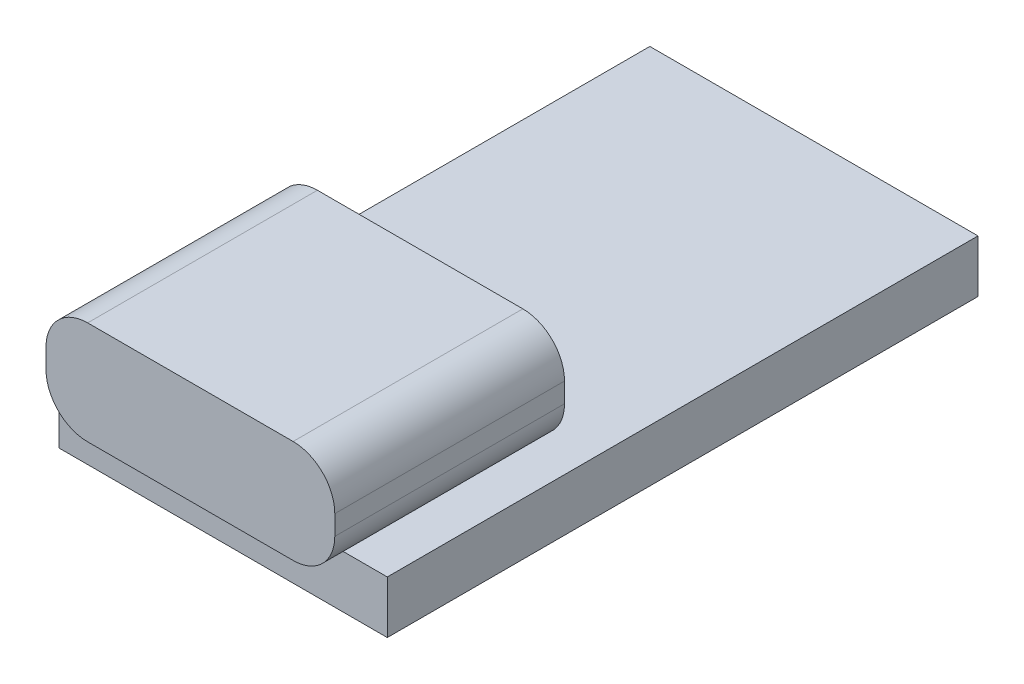
ISO-10303-21;
HEADER;
FILE_DESCRIPTION(('STEP AP214'),'2;1');
FILE_NAME('part.step','',(''),(''),'','','');
FILE_SCHEMA(('AUTOMOTIVE_DESIGN { 1 0 10303 214 1 1 1 1 }'));
ENDSEC;
DATA;
#1=APPLICATION_CONTEXT('core data for automotive mechanical design processes');
#2=APPLICATION_PROTOCOL_DEFINITION('international standard','automotive_design',2000,#1);
#3=PRODUCT_CONTEXT('',#1,'mechanical');
#4=PRODUCT('Part','Part','',(#3));
#5=PRODUCT_RELATED_PRODUCT_CATEGORY('part','',(#4));
#6=PRODUCT_DEFINITION_FORMATION('','',#4);
#7=PRODUCT_DEFINITION_CONTEXT('part definition',#1,'design');
#8=PRODUCT_DEFINITION('design','',#6,#7);
#9=PRODUCT_DEFINITION_SHAPE('','',#8);
#10=(LENGTH_UNIT() NAMED_UNIT(*) SI_UNIT(.MILLI.,.METRE.));
#11=(NAMED_UNIT(*) PLANE_ANGLE_UNIT() SI_UNIT($,.RADIAN.));
#12=(NAMED_UNIT(*) SI_UNIT($,.STERADIAN.) SOLID_ANGLE_UNIT());
#13=UNCERTAINTY_MEASURE_WITH_UNIT(LENGTH_MEASURE(1.E-05),#10,'distance_accuracy_value','');
#14=(GEOMETRIC_REPRESENTATION_CONTEXT(3) GLOBAL_UNCERTAINTY_ASSIGNED_CONTEXT((#13)) GLOBAL_UNIT_ASSIGNED_CONTEXT((#10,
#11,#12)) REPRESENTATION_CONTEXT('',''));
#15=CARTESIAN_POINT('',(0.,0.,0.));
#16=DIRECTION('',(0.,0.,1.));
#17=DIRECTION('',(1.,0.,0.));
#18=AXIS2_PLACEMENT_3D('',#15,#16,#17);
#19=CARTESIAN_POINT('',(0.,1.6,0.));
#20=DIRECTION('',(1.,0.,0.));
#21=DIRECTION('',(0.,0.,-1.));
#22=AXIS2_PLACEMENT_3D('',#19,#20,#21);
#23=PLANE('',#22);
#24=DIRECTION('',(0.,0.,1.));
#25=VECTOR('',#24,1.);
#26=CARTESIAN_POINT('',(0.,0.,0.));
#27=LINE('',#26,#25);
#28=CARTESIAN_POINT('',(0.,0.,-18.));
#29=VERTEX_POINT('',#28);
#30=CARTESIAN_POINT('',(0.,0.,0.));
#31=VERTEX_POINT('',#30);
#32=EDGE_CURVE('E214',#29,#31,#27,.T.);
#33=ORIENTED_EDGE('',*,*,#32,.T.);
#34=DIRECTION('',(0.,-1.,0.));
#35=VECTOR('',#34,1.);
#36=CARTESIAN_POINT('',(0.,1.6,0.));
#37=LINE('',#36,#35);
#38=CARTESIAN_POINT('',(0.,1.6,0.));
#39=VERTEX_POINT('',#38);
#40=EDGE_CURVE('E11',#39,#31,#37,.T.);
#41=ORIENTED_EDGE('',*,*,#40,.F.);
#42=DIRECTION('',(0.,0.,1.));
#43=VECTOR('',#42,1.);
#44=CARTESIAN_POINT('',(0.,1.6,0.));
#45=LINE('',#44,#43);
#46=CARTESIAN_POINT('',(0.,1.6,-18.));
#47=VERTEX_POINT('',#46);
#48=EDGE_CURVE('E230',#47,#39,#45,.T.);
#49=ORIENTED_EDGE('',*,*,#48,.F.);
#50=DIRECTION('',(0.,-1.,0.));
#51=VECTOR('',#50,1.);
#52=CARTESIAN_POINT('',(0.,1.6,-18.));
#53=LINE('',#52,#51);
#54=EDGE_CURVE('E238',#47,#29,#53,.T.);
#55=ORIENTED_EDGE('',*,*,#54,.T.);
#56=EDGE_LOOP('',(#33,#41,#49,#55));
#57=FACE_BOUND('',#56,.T.);
#58=ADVANCED_FACE('F49',(#57),#23,.F.);
#59=CARTESIAN_POINT('',(0.,1.6,0.));
#60=DIRECTION('',(0.,0.,-1.));
#61=DIRECTION('',(-1.,0.,0.));
#62=AXIS2_PLACEMENT_3D('',#59,#60,#61);
#63=PLANE('',#62);
#64=DIRECTION('',(1.,0.,0.));
#65=VECTOR('',#64,1.);
#66=CARTESIAN_POINT('',(0.,0.,0.));
#67=LINE('',#66,#65);
#68=CARTESIAN_POINT('',(10.,0.,0.));
#69=VERTEX_POINT('',#68);
#70=EDGE_CURVE('E241',#31,#69,#67,.T.);
#71=ORIENTED_EDGE('',*,*,#70,.T.);
#72=DIRECTION('',(0.,-1.,0.));
#73=VECTOR('',#72,1.);
#74=CARTESIAN_POINT('',(10.,1.6,0.));
#75=LINE('',#74,#73);
#76=CARTESIAN_POINT('',(10.,1.6,0.));
#77=VERTEX_POINT('',#76);
#78=EDGE_CURVE('E56',#77,#69,#75,.T.);
#79=ORIENTED_EDGE('',*,*,#78,.F.);
#80=DIRECTION('',(1.,0.,0.));
#81=VECTOR('',#80,1.);
#82=CARTESIAN_POINT('',(0.,1.6,0.));
#83=LINE('',#82,#81);
#84=CARTESIAN_POINT('',(8.13,1.6,0.));
#85=VERTEX_POINT('',#84);
#86=EDGE_CURVE('E232',#85,#77,#83,.T.);
#87=ORIENTED_EDGE('',*,*,#86,.F.);
#88=CARTESIAN_POINT('',(1.87,1.6,0.));
#89=VERTEX_POINT('',#88);
#90=EDGE_CURVE('E235',#89,#85,#83,.T.);
#91=ORIENTED_EDGE('',*,*,#90,.F.);
#92=EDGE_CURVE('E100',#39,#89,#83,.T.);
#93=ORIENTED_EDGE('',*,*,#92,.F.);
#94=ORIENTED_EDGE('',*,*,#40,.T.);
#95=EDGE_LOOP('',(#71,#79,#87,#91,#93,#94));
#96=FACE_BOUND('',#95,.T.);
#97=ADVANCED_FACE('F271',(#96),#63,.F.);
#98=CARTESIAN_POINT('',(10.,1.6,0.));
#99=DIRECTION('',(-1.,0.,0.));
#100=DIRECTION('',(0.,0.,1.));
#101=AXIS2_PLACEMENT_3D('',#98,#99,#100);
#102=PLANE('',#101);
#103=DIRECTION('',(0.,0.,-1.));
#104=VECTOR('',#103,1.);
#105=CARTESIAN_POINT('',(10.,0.,0.));
#106=LINE('',#105,#104);
#107=CARTESIAN_POINT('',(10.,0.,-18.));
#108=VERTEX_POINT('',#107);
#109=EDGE_CURVE('E243',#69,#108,#106,.T.);
#110=ORIENTED_EDGE('',*,*,#109,.T.);
#111=DIRECTION('',(0.,-1.,0.));
#112=VECTOR('',#111,1.);
#113=CARTESIAN_POINT('',(10.,1.6,-18.));
#114=LINE('',#113,#112);
#115=CARTESIAN_POINT('',(10.,1.6,-18.));
#116=VERTEX_POINT('',#115);
#117=EDGE_CURVE('E247',#116,#108,#114,.T.);
#118=ORIENTED_EDGE('',*,*,#117,.F.);
#119=DIRECTION('',(0.,0.,-1.));
#120=VECTOR('',#119,1.);
#121=CARTESIAN_POINT('',(10.,1.6,0.));
#122=LINE('',#121,#120);
#123=EDGE_CURVE('E234',#77,#116,#122,.T.);
#124=ORIENTED_EDGE('',*,*,#123,.F.);
#125=ORIENTED_EDGE('',*,*,#78,.T.);
#126=EDGE_LOOP('',(#110,#118,#124,#125));
#127=FACE_BOUND('',#126,.T.);
#128=ADVANCED_FACE('F253',(#127),#102,.F.);
#129=CARTESIAN_POINT('',(0.,1.6,-18.));
#130=DIRECTION('',(0.,0.,1.));
#131=DIRECTION('',(1.,0.,0.));
#132=AXIS2_PLACEMENT_3D('',#129,#130,#131);
#133=PLANE('',#132);
#134=DIRECTION('',(-1.,0.,0.));
#135=VECTOR('',#134,1.);
#136=CARTESIAN_POINT('',(0.,0.,-18.));
#137=LINE('',#136,#135);
#138=EDGE_CURVE('E93',#108,#29,#137,.T.);
#139=ORIENTED_EDGE('',*,*,#138,.T.);
#140=ORIENTED_EDGE('',*,*,#54,.F.);
#141=DIRECTION('',(-1.,0.,0.));
#142=VECTOR('',#141,1.);
#143=CARTESIAN_POINT('',(0.,1.6,-18.));
#144=LINE('',#143,#142);
#145=EDGE_CURVE('E72',#116,#47,#144,.T.);
#146=ORIENTED_EDGE('',*,*,#145,.F.);
#147=ORIENTED_EDGE('',*,*,#117,.T.);
#148=EDGE_LOOP('',(#139,#140,#146,#147));
#149=FACE_BOUND('',#148,.T.);
#150=ADVANCED_FACE('F262',(#149),#133,.F.);
#151=CARTESIAN_POINT('',(0.,1.6,0.));
#152=DIRECTION('',(0.,-1.,0.));
#153=DIRECTION('',(0.,0.,-1.));
#154=AXIS2_PLACEMENT_3D('',#151,#152,#153);
#155=PLANE('',#154);
#156=DIRECTION('',(1.,0.,0.));
#157=VECTOR('',#156,1.);
#158=CARTESIAN_POINT('',(1.87,1.6,-6.));
#159=LINE('',#158,#157);
#160=CARTESIAN_POINT('',(1.87,1.6,-6.));
#161=VERTEX_POINT('',#160);
#162=CARTESIAN_POINT('',(8.13,1.6,-6.));
#163=VERTEX_POINT('',#162);
#164=EDGE_CURVE('E191',#161,#163,#159,.T.);
#165=ORIENTED_EDGE('',*,*,#164,.T.);
#166=DIRECTION('',(0.,0.,1.));
#167=VECTOR('',#166,1.);
#168=CARTESIAN_POINT('',(8.13,1.6,-6.));
#169=LINE('',#168,#167);
#170=EDGE_CURVE('E217',#163,#85,#169,.T.);
#171=ORIENTED_EDGE('',*,*,#170,.T.);
#172=ORIENTED_EDGE('',*,*,#86,.T.);
#173=ORIENTED_EDGE('',*,*,#123,.T.);
#174=ORIENTED_EDGE('',*,*,#145,.T.);
#175=ORIENTED_EDGE('',*,*,#48,.T.);
#176=ORIENTED_EDGE('',*,*,#92,.T.);
#177=DIRECTION('',(0.,0.,1.));
#178=VECTOR('',#177,1.);
#179=CARTESIAN_POINT('',(1.87,1.6,-6.));
#180=LINE('',#179,#178);
#181=EDGE_CURVE('E221',#161,#89,#180,.T.);
#182=ORIENTED_EDGE('',*,*,#181,.F.);
#183=EDGE_LOOP('',(#165,#171,#172,#173,#174,#175,#176,#182));
#184=FACE_BOUND('',#183,.T.);
#185=ADVANCED_FACE('F264',(#184),#155,.F.);
#186=CARTESIAN_POINT('',(0.,0.,0.));
#187=DIRECTION('',(0.,-1.,0.));
#188=DIRECTION('',(0.,0.,-1.));
#189=AXIS2_PLACEMENT_3D('',#186,#187,#188);
#190=PLANE('',#189);
#191=ORIENTED_EDGE('',*,*,#32,.F.);
#192=ORIENTED_EDGE('',*,*,#138,.F.);
#193=ORIENTED_EDGE('',*,*,#109,.F.);
#194=ORIENTED_EDGE('',*,*,#70,.F.);
#195=EDGE_LOOP('',(#191,#192,#193,#194));
#196=FACE_BOUND('',#195,.T.);
#197=ADVANCED_FACE('F258',(#196),#190,.T.);
#198=CARTESIAN_POINT('',(1.87,1.6,-6.));
#199=DIRECTION('',(0.,-1.,0.));
#200=DIRECTION('',(0.,0.,-1.));
#201=AXIS2_PLACEMENT_3D('',#198,#199,#200);
#202=PLANE('',#201);
#203=ORIENTED_EDGE('',*,*,#90,.T.);
#204=CARTESIAN_POINT('',(8.13,1.6,1.));
#205=VERTEX_POINT('',#204);
#206=EDGE_CURVE('E220',#85,#205,#169,.T.);
#207=ORIENTED_EDGE('',*,*,#206,.T.);
#208=DIRECTION('',(1.,0.,0.));
#209=VECTOR('',#208,1.);
#210=CARTESIAN_POINT('',(1.87,1.6,1.));
#211=LINE('',#210,#209);
#212=CARTESIAN_POINT('',(1.87,1.6,1.));
#213=VERTEX_POINT('',#212);
#214=EDGE_CURVE('E208',#213,#205,#211,.T.);
#215=ORIENTED_EDGE('',*,*,#214,.F.);
#216=EDGE_CURVE('E224',#89,#213,#180,.T.);
#217=ORIENTED_EDGE('',*,*,#216,.F.);
#218=EDGE_LOOP('',(#203,#207,#215,#217));
#219=FACE_BOUND('',#218,.T.);
#220=ADVANCED_FACE('F305',(#219),#202,.T.);
#221=CARTESIAN_POINT('',(8.13,3.47,-6.));
#222=DIRECTION('',(0.,0.,1.));
#223=DIRECTION('',(1.,0.,0.));
#224=AXIS2_PLACEMENT_3D('',#221,#222,#223);
#225=CYLINDRICAL_SURFACE('',#224,1.27);
#226=CARTESIAN_POINT('',(8.13,3.47,1.));
#227=DIRECTION('',(0.,0.,1.));
#228=DIRECTION('',(-1.,0.,0.));
#229=AXIS2_PLACEMENT_3D('',#226,#227,#228);
#230=CIRCLE('',#229,1.27);
#231=CARTESIAN_POINT('',(9.4,3.47,1.));
#232=VERTEX_POINT('',#231);
#233=CARTESIAN_POINT('',(8.13,4.74,1.));
#234=VERTEX_POINT('',#233);
#235=EDGE_CURVE('E196',#232,#234,#230,.T.);
#236=ORIENTED_EDGE('',*,*,#235,.F.);
#237=DIRECTION('',(0.,0.,1.));
#238=VECTOR('',#237,1.);
#239=CARTESIAN_POINT('',(9.4,3.47,-6.));
#240=LINE('',#239,#238);
#241=CARTESIAN_POINT('',(9.4,3.47,-6.));
#242=VERTEX_POINT('',#241);
#243=EDGE_CURVE('E177',#242,#232,#240,.T.);
#244=ORIENTED_EDGE('',*,*,#243,.F.);
#245=CARTESIAN_POINT('',(8.13,3.47,-6.));
#246=DIRECTION('',(0.,0.,1.));
#247=DIRECTION('',(-1.,0.,0.));
#248=AXIS2_PLACEMENT_3D('',#245,#246,#247);
#249=CIRCLE('',#248,1.27);
#250=CARTESIAN_POINT('',(8.13,4.74,-6.));
#251=VERTEX_POINT('',#250);
#252=EDGE_CURVE('E170',#242,#251,#249,.T.);
#253=ORIENTED_EDGE('',*,*,#252,.T.);
#254=DIRECTION('',(0.,0.,1.));
#255=VECTOR('',#254,1.);
#256=CARTESIAN_POINT('',(8.13,4.74,-6.));
#257=LINE('',#256,#255);
#258=EDGE_CURVE('E154',#251,#234,#257,.T.);
#259=ORIENTED_EDGE('',*,*,#258,.T.);
#260=EDGE_LOOP('',(#236,#244,#253,#259));
#261=FACE_BOUND('',#260,.T.);
#262=ADVANCED_FACE('F176',(#261),#225,.T.);
#263=CARTESIAN_POINT('',(9.4,3.47,-6.));
#264=DIRECTION('',(1.,0.,0.));
#265=DIRECTION('',(0.,0.,-1.));
#266=AXIS2_PLACEMENT_3D('',#263,#264,#265);
#267=PLANE('',#266);
#268=DIRECTION('',(0.,1.,0.));
#269=VECTOR('',#268,1.);
#270=CARTESIAN_POINT('',(9.4,3.47,1.));
#271=LINE('',#270,#269);
#272=CARTESIAN_POINT('',(9.4,2.87,1.));
#273=VERTEX_POINT('',#272);
#274=EDGE_CURVE('E178',#273,#232,#271,.T.);
#275=ORIENTED_EDGE('',*,*,#274,.F.);
#276=DIRECTION('',(0.,0.,1.));
#277=VECTOR('',#276,1.);
#278=CARTESIAN_POINT('',(9.4,2.87,-6.));
#279=LINE('',#278,#277);
#280=CARTESIAN_POINT('',(9.4,2.87,-6.));
#281=VERTEX_POINT('',#280);
#282=EDGE_CURVE('E215',#281,#273,#279,.T.);
#283=ORIENTED_EDGE('',*,*,#282,.F.);
#284=DIRECTION('',(0.,1.,0.));
#285=VECTOR('',#284,1.);
#286=CARTESIAN_POINT('',(9.4,3.47,-6.));
#287=LINE('',#286,#285);
#288=EDGE_CURVE('E165',#281,#242,#287,.T.);
#289=ORIENTED_EDGE('',*,*,#288,.T.);
#290=ORIENTED_EDGE('',*,*,#243,.T.);
#291=EDGE_LOOP('',(#275,#283,#289,#290));
#292=FACE_BOUND('',#291,.T.);
#293=ADVANCED_FACE('F314',(#292),#267,.T.);
#294=CARTESIAN_POINT('',(8.13,2.87,-6.));
#295=DIRECTION('',(0.,0.,1.));
#296=DIRECTION('',(1.,0.,0.));
#297=AXIS2_PLACEMENT_3D('',#294,#295,#296);
#298=CYLINDRICAL_SURFACE('',#297,1.27);
#299=CARTESIAN_POINT('',(8.13,2.87,1.));
#300=DIRECTION('',(0.,0.,1.));
#301=DIRECTION('',(1.,0.,0.));
#302=AXIS2_PLACEMENT_3D('',#299,#300,#301);
#303=CIRCLE('',#302,1.27);
#304=EDGE_CURVE('E181',#205,#273,#303,.T.);
#305=ORIENTED_EDGE('',*,*,#304,.F.);
#306=ORIENTED_EDGE('',*,*,#206,.F.);
#307=ORIENTED_EDGE('',*,*,#170,.F.);
#308=CARTESIAN_POINT('',(8.13,2.87,-6.));
#309=DIRECTION('',(0.,0.,1.));
#310=DIRECTION('',(1.,0.,0.));
#311=AXIS2_PLACEMENT_3D('',#308,#309,#310);
#312=CIRCLE('',#311,1.27);
#313=EDGE_CURVE('E63',#163,#281,#312,.T.);
#314=ORIENTED_EDGE('',*,*,#313,.T.);
#315=ORIENTED_EDGE('',*,*,#282,.T.);
#316=EDGE_LOOP('',(#305,#306,#307,#314,#315));
#317=FACE_BOUND('',#316,.T.);
#318=ADVANCED_FACE('F324',(#317),#298,.T.);
#319=CARTESIAN_POINT('',(1.87,2.87,-6.));
#320=DIRECTION('',(0.,0.,1.));
#321=DIRECTION('',(1.,0.,0.));
#322=AXIS2_PLACEMENT_3D('',#319,#320,#321);
#323=CYLINDRICAL_SURFACE('',#322,1.27);
#324=CARTESIAN_POINT('',(1.87,2.87,1.));
#325=DIRECTION('',(0.,0.,1.));
#326=DIRECTION('',(1.,0.,0.));
#327=AXIS2_PLACEMENT_3D('',#324,#325,#326);
#328=CIRCLE('',#327,1.27);
#329=CARTESIAN_POINT('',(0.6,2.87,1.));
#330=VERTEX_POINT('',#329);
#331=EDGE_CURVE('E205',#330,#213,#328,.T.);
#332=ORIENTED_EDGE('',*,*,#331,.F.);
#333=DIRECTION('',(0.,0.,1.));
#334=VECTOR('',#333,1.);
#335=CARTESIAN_POINT('',(0.6,2.87,-6.));
#336=LINE('',#335,#334);
#337=CARTESIAN_POINT('',(0.6,2.87,-6.));
#338=VERTEX_POINT('',#337);
#339=EDGE_CURVE('E225',#338,#330,#336,.T.);
#340=ORIENTED_EDGE('',*,*,#339,.F.);
#341=CARTESIAN_POINT('',(1.87,2.87,-6.));
#342=DIRECTION('',(0.,0.,1.));
#343=DIRECTION('',(1.,0.,0.));
#344=AXIS2_PLACEMENT_3D('',#341,#342,#343);
#345=CIRCLE('',#344,1.27);
#346=EDGE_CURVE('E188',#338,#161,#345,.T.);
#347=ORIENTED_EDGE('',*,*,#346,.T.);
#348=ORIENTED_EDGE('',*,*,#181,.T.);
#349=ORIENTED_EDGE('',*,*,#216,.T.);
#350=EDGE_LOOP('',(#332,#340,#347,#348,#349));
#351=FACE_BOUND('',#350,.T.);
#352=ADVANCED_FACE('F334',(#351),#323,.T.);
#353=CARTESIAN_POINT('',(0.6,3.47,-6.));
#354=DIRECTION('',(-1.,0.,0.));
#355=DIRECTION('',(0.,0.,1.));
#356=AXIS2_PLACEMENT_3D('',#353,#354,#355);
#357=PLANE('',#356);
#358=DIRECTION('',(0.,-1.,0.));
#359=VECTOR('',#358,1.);
#360=CARTESIAN_POINT('',(0.6,3.47,1.));
#361=LINE('',#360,#359);
#362=CARTESIAN_POINT('',(0.600000000000001,3.47,1.));
#363=VERTEX_POINT('',#362);
#364=EDGE_CURVE('E202',#363,#330,#361,.T.);
#365=ORIENTED_EDGE('',*,*,#364,.F.);
#366=DIRECTION('',(0.,0.,1.));
#367=VECTOR('',#366,1.);
#368=CARTESIAN_POINT('',(0.600000000000001,3.47,-6.));
#369=LINE('',#368,#367);
#370=CARTESIAN_POINT('',(0.600000000000001,3.47,-6.));
#371=VERTEX_POINT('',#370);
#372=EDGE_CURVE('E227',#371,#363,#369,.T.);
#373=ORIENTED_EDGE('',*,*,#372,.F.);
#374=DIRECTION('',(0.,-1.,0.));
#375=VECTOR('',#374,1.);
#376=CARTESIAN_POINT('',(0.6,3.47,-6.));
#377=LINE('',#376,#375);
#378=EDGE_CURVE('E185',#371,#338,#377,.T.);
#379=ORIENTED_EDGE('',*,*,#378,.T.);
#380=ORIENTED_EDGE('',*,*,#339,.T.);
#381=EDGE_LOOP('',(#365,#373,#379,#380));
#382=FACE_BOUND('',#381,.T.);
#383=ADVANCED_FACE('F345',(#382),#357,.T.);
#384=CARTESIAN_POINT('',(1.87,3.47,-6.));
#385=DIRECTION('',(0.,0.,1.));
#386=DIRECTION('',(1.,0.,0.));
#387=AXIS2_PLACEMENT_3D('',#384,#385,#386);
#388=CYLINDRICAL_SURFACE('',#387,1.27);
#389=CARTESIAN_POINT('',(1.87,3.47,1.));
#390=DIRECTION('',(0.,0.,1.));
#391=DIRECTION('',(1.,0.,0.));
#392=AXIS2_PLACEMENT_3D('',#389,#390,#391);
#393=CIRCLE('',#392,1.27);
#394=CARTESIAN_POINT('',(1.87,4.74,1.));
#395=VERTEX_POINT('',#394);
#396=EDGE_CURVE('E199',#395,#363,#393,.T.);
#397=ORIENTED_EDGE('',*,*,#396,.F.);
#398=DIRECTION('',(0.,0.,1.));
#399=VECTOR('',#398,1.);
#400=CARTESIAN_POINT('',(1.87,4.74,-6.));
#401=LINE('',#400,#399);
#402=CARTESIAN_POINT('',(1.87,4.74,-6.));
#403=VERTEX_POINT('',#402);
#404=EDGE_CURVE('E164',#403,#395,#401,.T.);
#405=ORIENTED_EDGE('',*,*,#404,.F.);
#406=CARTESIAN_POINT('',(1.87,3.47,-6.));
#407=DIRECTION('',(0.,0.,1.));
#408=DIRECTION('',(1.,0.,0.));
#409=AXIS2_PLACEMENT_3D('',#406,#407,#408);
#410=CIRCLE('',#409,1.27);
#411=EDGE_CURVE('E174',#403,#371,#410,.T.);
#412=ORIENTED_EDGE('',*,*,#411,.T.);
#413=ORIENTED_EDGE('',*,*,#372,.T.);
#414=EDGE_LOOP('',(#397,#405,#412,#413));
#415=FACE_BOUND('',#414,.T.);
#416=ADVANCED_FACE('F355',(#415),#388,.T.);
#417=CARTESIAN_POINT('',(1.87,4.74,-6.));
#418=DIRECTION('',(0.,1.,0.));
#419=DIRECTION('',(0.,0.,1.));
#420=AXIS2_PLACEMENT_3D('',#417,#418,#419);
#421=PLANE('',#420);
#422=DIRECTION('',(-1.,0.,0.));
#423=VECTOR('',#422,1.);
#424=CARTESIAN_POINT('',(1.87,4.74,1.));
#425=LINE('',#424,#423);
#426=EDGE_CURVE('E159',#234,#395,#425,.T.);
#427=ORIENTED_EDGE('',*,*,#426,.F.);
#428=ORIENTED_EDGE('',*,*,#258,.F.);
#429=DIRECTION('',(-1.,0.,0.));
#430=VECTOR('',#429,1.);
#431=CARTESIAN_POINT('',(1.87,4.74,-6.));
#432=LINE('',#431,#430);
#433=EDGE_CURVE('E157',#251,#403,#432,.T.);
#434=ORIENTED_EDGE('',*,*,#433,.T.);
#435=ORIENTED_EDGE('',*,*,#404,.T.);
#436=EDGE_LOOP('',(#427,#428,#434,#435));
#437=FACE_BOUND('',#436,.T.);
#438=ADVANCED_FACE('F156',(#437),#421,.T.);
#439=CARTESIAN_POINT('',(8.13,3.47,-6.));
#440=DIRECTION('',(0.,0.,-1.));
#441=DIRECTION('',(-1.,0.,0.));
#442=AXIS2_PLACEMENT_3D('',#439,#440,#441);
#443=PLANE('',#442);
#444=ORIENTED_EDGE('',*,*,#252,.F.);
#445=ORIENTED_EDGE('',*,*,#288,.F.);
#446=ORIENTED_EDGE('',*,*,#313,.F.);
#447=ORIENTED_EDGE('',*,*,#164,.F.);
#448=ORIENTED_EDGE('',*,*,#346,.F.);
#449=ORIENTED_EDGE('',*,*,#378,.F.);
#450=ORIENTED_EDGE('',*,*,#411,.F.);
#451=ORIENTED_EDGE('',*,*,#433,.F.);
#452=EDGE_LOOP('',(#444,#445,#446,#447,#448,#449,#450,#451));
#453=FACE_BOUND('',#452,.T.);
#454=ADVANCED_FACE('F169',(#453),#443,.T.);
#455=CARTESIAN_POINT('',(8.13,3.47,1.));
#456=DIRECTION('',(0.,0.,-1.));
#457=DIRECTION('',(-1.,0.,0.));
#458=AXIS2_PLACEMENT_3D('',#455,#456,#457);
#459=PLANE('',#458);
#460=ORIENTED_EDGE('',*,*,#235,.T.);
#461=ORIENTED_EDGE('',*,*,#426,.T.);
#462=ORIENTED_EDGE('',*,*,#396,.T.);
#463=ORIENTED_EDGE('',*,*,#364,.T.);
#464=ORIENTED_EDGE('',*,*,#331,.T.);
#465=ORIENTED_EDGE('',*,*,#214,.T.);
#466=ORIENTED_EDGE('',*,*,#304,.T.);
#467=ORIENTED_EDGE('',*,*,#274,.T.);
#468=EDGE_LOOP('',(#460,#461,#462,#463,#464,#465,#466,#467));
#469=FACE_BOUND('',#468,.T.);
#470=ADVANCED_FACE('F381',(#469),#459,.F.);
#471=CLOSED_SHELL('',(#58,#97,#128,#150,#185,#197,#220,#262,#293,#318,#352,#383,#416,#438,#454,#470));
#472=MANIFOLD_SOLID_BREP('B2',#471);
#473=ADVANCED_BREP_SHAPE_REPRESENTATION('',(#18,#472),#14);
#474=SHAPE_DEFINITION_REPRESENTATION(#9,#473);
ENDSEC;
END-ISO-10303-21;
